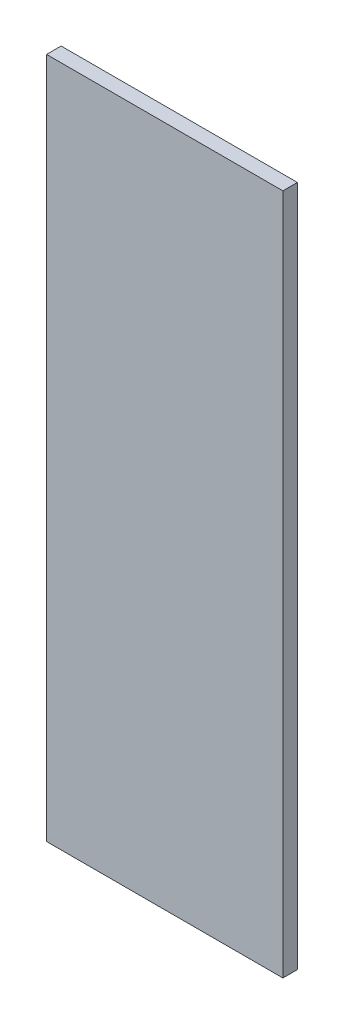
ISO-10303-21;
HEADER;
FILE_DESCRIPTION(('STEP AP214'),'2;1');
FILE_NAME('part.step','',(''),(''),'','','');
FILE_SCHEMA(('AUTOMOTIVE_DESIGN { 1 0 10303 214 1 1 1 1 }'));
ENDSEC;
DATA;
#1=APPLICATION_CONTEXT('core data for automotive mechanical design processes');
#2=APPLICATION_PROTOCOL_DEFINITION('international standard','automotive_design',2000,#1);
#3=PRODUCT_CONTEXT('',#1,'mechanical');
#4=PRODUCT('Part','Part','',(#3));
#5=PRODUCT_RELATED_PRODUCT_CATEGORY('part','',(#4));
#6=PRODUCT_DEFINITION_FORMATION('','',#4);
#7=PRODUCT_DEFINITION_CONTEXT('part definition',#1,'design');
#8=PRODUCT_DEFINITION('design','',#6,#7);
#9=PRODUCT_DEFINITION_SHAPE('','',#8);
#10=(LENGTH_UNIT() NAMED_UNIT(*) SI_UNIT(.MILLI.,.METRE.));
#11=(NAMED_UNIT(*) PLANE_ANGLE_UNIT() SI_UNIT($,.RADIAN.));
#12=(NAMED_UNIT(*) SI_UNIT($,.STERADIAN.) SOLID_ANGLE_UNIT());
#13=UNCERTAINTY_MEASURE_WITH_UNIT(LENGTH_MEASURE(1.E-05),#10,'distance_accuracy_value','');
#14=(GEOMETRIC_REPRESENTATION_CONTEXT(3) GLOBAL_UNCERTAINTY_ASSIGNED_CONTEXT((#13)) GLOBAL_UNIT_ASSIGNED_CONTEXT((#10,
#11,#12)) REPRESENTATION_CONTEXT('',''));
#15=CARTESIAN_POINT('',(0.,0.,0.));
#16=DIRECTION('',(0.,0.,1.));
#17=DIRECTION('',(1.,0.,0.));
#18=AXIS2_PLACEMENT_3D('',#15,#16,#17);
#19=CARTESIAN_POINT('',(13.,-37.5,1.6));
#20=DIRECTION('',(-1.,0.,0.));
#21=DIRECTION('',(0.,0.,1.));
#22=AXIS2_PLACEMENT_3D('',#19,#20,#21);
#23=PLANE('',#22);
#24=DIRECTION('',(0.,1.,0.));
#25=VECTOR('',#24,1.);
#26=CARTESIAN_POINT('',(13.,-37.5,0.));
#27=LINE('',#26,#25);
#28=CARTESIAN_POINT('',(13.,-37.5,0.));
#29=VERTEX_POINT('',#28);
#30=CARTESIAN_POINT('',(13.,37.5,0.));
#31=VERTEX_POINT('',#30);
#32=EDGE_CURVE('E102',#29,#31,#27,.T.);
#33=ORIENTED_EDGE('',*,*,#32,.T.);
#34=DIRECTION('',(0.,0.,-1.));
#35=VECTOR('',#34,1.);
#36=CARTESIAN_POINT('',(13.,37.5,1.6));
#37=LINE('',#36,#35);
#38=CARTESIAN_POINT('',(13.,37.5,1.6));
#39=VERTEX_POINT('',#38);
#40=EDGE_CURVE('E11',#39,#31,#37,.T.);
#41=ORIENTED_EDGE('',*,*,#40,.F.);
#42=DIRECTION('',(0.,1.,0.));
#43=VECTOR('',#42,1.);
#44=CARTESIAN_POINT('',(13.,-37.5,1.6));
#45=LINE('',#44,#43);
#46=CARTESIAN_POINT('',(13.,-37.5,1.6));
#47=VERTEX_POINT('',#46);
#48=EDGE_CURVE('E88',#47,#39,#45,.T.);
#49=ORIENTED_EDGE('',*,*,#48,.F.);
#50=DIRECTION('',(0.,0.,-1.));
#51=VECTOR('',#50,1.);
#52=CARTESIAN_POINT('',(13.,-37.5,1.6));
#53=LINE('',#52,#51);
#54=EDGE_CURVE('E98',#47,#29,#53,.T.);
#55=ORIENTED_EDGE('',*,*,#54,.T.);
#56=EDGE_LOOP('',(#33,#41,#49,#55));
#57=FACE_BOUND('',#56,.T.);
#58=ADVANCED_FACE('F37',(#57),#23,.F.);
#59=CARTESIAN_POINT('',(-13.,37.5,1.6));
#60=DIRECTION('',(0.,-1.,0.));
#61=DIRECTION('',(0.,0.,-1.));
#62=AXIS2_PLACEMENT_3D('',#59,#60,#61);
#63=PLANE('',#62);
#64=DIRECTION('',(-1.,0.,0.));
#65=VECTOR('',#64,1.);
#66=CARTESIAN_POINT('',(-13.,37.5,0.));
#67=LINE('',#66,#65);
#68=CARTESIAN_POINT('',(-13.,37.5,0.));
#69=VERTEX_POINT('',#68);
#70=EDGE_CURVE('E92',#31,#69,#67,.T.);
#71=ORIENTED_EDGE('',*,*,#70,.T.);
#72=DIRECTION('',(0.,0.,-1.));
#73=VECTOR('',#72,1.);
#74=CARTESIAN_POINT('',(-13.,37.5,1.6));
#75=LINE('',#74,#73);
#76=CARTESIAN_POINT('',(-13.,37.5,1.6));
#77=VERTEX_POINT('',#76);
#78=EDGE_CURVE('E45',#77,#69,#75,.T.);
#79=ORIENTED_EDGE('',*,*,#78,.F.);
#80=DIRECTION('',(-1.,0.,0.));
#81=VECTOR('',#80,1.);
#82=CARTESIAN_POINT('',(-13.,37.5,1.6));
#83=LINE('',#82,#81);
#84=EDGE_CURVE('E83',#39,#77,#83,.T.);
#85=ORIENTED_EDGE('',*,*,#84,.F.);
#86=ORIENTED_EDGE('',*,*,#40,.T.);
#87=EDGE_LOOP('',(#71,#79,#85,#86));
#88=FACE_BOUND('',#87,.T.);
#89=ADVANCED_FACE('F91',(#88),#63,.F.);
#90=CARTESIAN_POINT('',(-13.,-37.5,1.6));
#91=DIRECTION('',(1.,0.,0.));
#92=DIRECTION('',(0.,0.,-1.));
#93=AXIS2_PLACEMENT_3D('',#90,#91,#92);
#94=PLANE('',#93);
#95=DIRECTION('',(0.,-1.,0.));
#96=VECTOR('',#95,1.);
#97=CARTESIAN_POINT('',(-13.,-37.5,0.));
#98=LINE('',#97,#96);
#99=CARTESIAN_POINT('',(-13.,-37.5,0.));
#100=VERTEX_POINT('',#99);
#101=EDGE_CURVE('E70',#69,#100,#98,.T.);
#102=ORIENTED_EDGE('',*,*,#101,.T.);
#103=DIRECTION('',(0.,0.,-1.));
#104=VECTOR('',#103,1.);
#105=CARTESIAN_POINT('',(-13.,-37.5,1.6));
#106=LINE('',#105,#104);
#107=CARTESIAN_POINT('',(-13.,-37.5,1.6));
#108=VERTEX_POINT('',#107);
#109=EDGE_CURVE('E93',#108,#100,#106,.T.);
#110=ORIENTED_EDGE('',*,*,#109,.F.);
#111=DIRECTION('',(0.,-1.,0.));
#112=VECTOR('',#111,1.);
#113=CARTESIAN_POINT('',(-13.,-37.5,1.6));
#114=LINE('',#113,#112);
#115=EDGE_CURVE('E86',#77,#108,#114,.T.);
#116=ORIENTED_EDGE('',*,*,#115,.F.);
#117=ORIENTED_EDGE('',*,*,#78,.T.);
#118=EDGE_LOOP('',(#102,#110,#116,#117));
#119=FACE_BOUND('',#118,.T.);
#120=ADVANCED_FACE('F94',(#119),#94,.F.);
#121=CARTESIAN_POINT('',(-13.,-37.5,1.6));
#122=DIRECTION('',(0.,1.,0.));
#123=DIRECTION('',(0.,0.,1.));
#124=AXIS2_PLACEMENT_3D('',#121,#122,#123);
#125=PLANE('',#124);
#126=DIRECTION('',(1.,0.,0.));
#127=VECTOR('',#126,1.);
#128=CARTESIAN_POINT('',(-13.,-37.5,0.));
#129=LINE('',#128,#127);
#130=EDGE_CURVE('E76',#100,#29,#129,.T.);
#131=ORIENTED_EDGE('',*,*,#130,.T.);
#132=ORIENTED_EDGE('',*,*,#54,.F.);
#133=DIRECTION('',(1.,0.,0.));
#134=VECTOR('',#133,1.);
#135=CARTESIAN_POINT('',(-13.,-37.5,1.6));
#136=LINE('',#135,#134);
#137=EDGE_CURVE('E53',#108,#47,#136,.T.);
#138=ORIENTED_EDGE('',*,*,#137,.F.);
#139=ORIENTED_EDGE('',*,*,#109,.T.);
#140=EDGE_LOOP('',(#131,#132,#138,#139));
#141=FACE_BOUND('',#140,.T.);
#142=ADVANCED_FACE('F109',(#141),#125,.F.);
#143=CARTESIAN_POINT('',(0.,0.,1.6));
#144=DIRECTION('',(0.,0.,-1.));
#145=DIRECTION('',(-1.,0.,0.));
#146=AXIS2_PLACEMENT_3D('',#143,#144,#145);
#147=PLANE('',#146);
#148=ORIENTED_EDGE('',*,*,#48,.T.);
#149=ORIENTED_EDGE('',*,*,#84,.T.);
#150=ORIENTED_EDGE('',*,*,#115,.T.);
#151=ORIENTED_EDGE('',*,*,#137,.T.);
#152=EDGE_LOOP('',(#148,#149,#150,#151));
#153=FACE_BOUND('',#152,.T.);
#154=ADVANCED_FACE('F84',(#153),#147,.F.);
#155=CARTESIAN_POINT('',(0.,0.,0.));
#156=DIRECTION('',(0.,0.,-1.));
#157=DIRECTION('',(-1.,0.,0.));
#158=AXIS2_PLACEMENT_3D('',#155,#156,#157);
#159=PLANE('',#158);
#160=ORIENTED_EDGE('',*,*,#32,.F.);
#161=ORIENTED_EDGE('',*,*,#130,.F.);
#162=ORIENTED_EDGE('',*,*,#101,.F.);
#163=ORIENTED_EDGE('',*,*,#70,.F.);
#164=EDGE_LOOP('',(#160,#161,#162,#163));
#165=FACE_BOUND('',#164,.T.);
#166=ADVANCED_FACE('F112',(#165),#159,.T.);
#167=CLOSED_SHELL('',(#58,#89,#120,#142,#154,#166));
#168=MANIFOLD_SOLID_BREP('B2',#167);
#169=ADVANCED_BREP_SHAPE_REPRESENTATION('',(#18,#168),#14);
#170=SHAPE_DEFINITION_REPRESENTATION(#9,#169);
ENDSEC;
END-ISO-10303-21;
